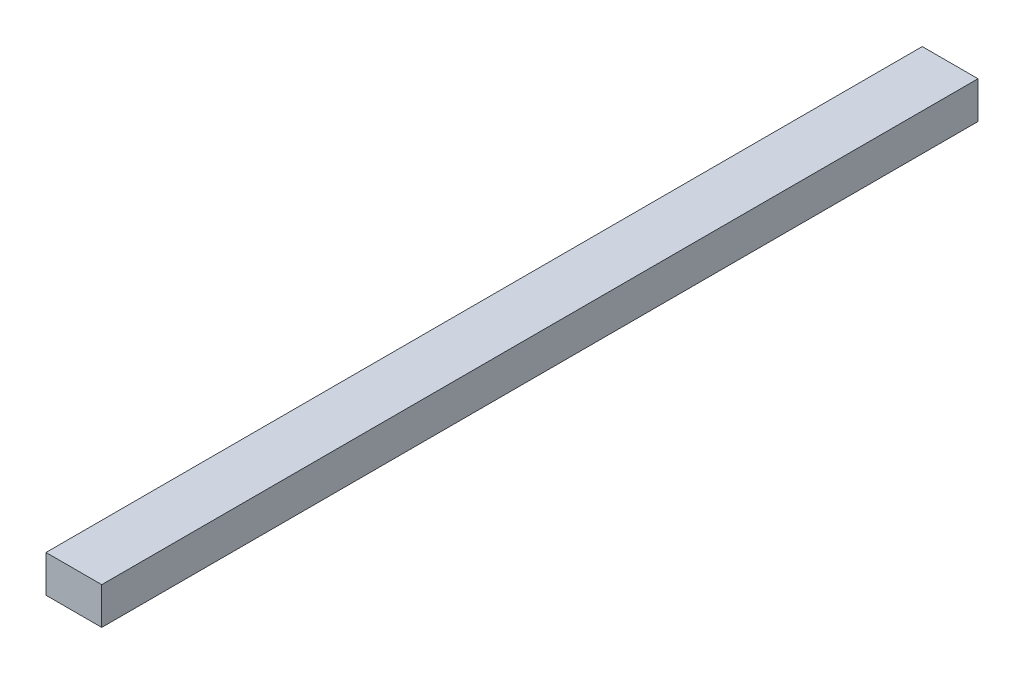
ISO-10303-21;
HEADER;
FILE_DESCRIPTION(('STEP AP214'),'2;1');
FILE_NAME('part.step','',(''),(''),'','','');
FILE_SCHEMA(('AUTOMOTIVE_DESIGN { 1 0 10303 214 1 1 1 1 }'));
ENDSEC;
DATA;
#1=APPLICATION_CONTEXT('core data for automotive mechanical design processes');
#2=APPLICATION_PROTOCOL_DEFINITION('international standard','automotive_design',2000,#1);
#3=PRODUCT_CONTEXT('',#1,'mechanical');
#4=PRODUCT('Part','Part','',(#3));
#5=PRODUCT_RELATED_PRODUCT_CATEGORY('part','',(#4));
#6=PRODUCT_DEFINITION_FORMATION('','',#4);
#7=PRODUCT_DEFINITION_CONTEXT('part definition',#1,'design');
#8=PRODUCT_DEFINITION('design','',#6,#7);
#9=PRODUCT_DEFINITION_SHAPE('','',#8);
#10=(LENGTH_UNIT() NAMED_UNIT(*) SI_UNIT(.MILLI.,.METRE.));
#11=(NAMED_UNIT(*) PLANE_ANGLE_UNIT() SI_UNIT($,.RADIAN.));
#12=(NAMED_UNIT(*) SI_UNIT($,.STERADIAN.) SOLID_ANGLE_UNIT());
#13=UNCERTAINTY_MEASURE_WITH_UNIT(LENGTH_MEASURE(1.E-05),#10,'distance_accuracy_value','');
#14=(GEOMETRIC_REPRESENTATION_CONTEXT(3) GLOBAL_UNCERTAINTY_ASSIGNED_CONTEXT((#13)) GLOBAL_UNIT_ASSIGNED_CONTEXT((#10,
#11,#12)) REPRESENTATION_CONTEXT('',''));
#15=CARTESIAN_POINT('',(0.,0.,0.));
#16=DIRECTION('',(0.,0.,1.));
#17=DIRECTION('',(1.,0.,0.));
#18=AXIS2_PLACEMENT_3D('',#15,#16,#17);
#19=CARTESIAN_POINT('',(0.,0.,-40.));
#20=DIRECTION('',(0.,0.,1.));
#21=DIRECTION('',(1.,0.,0.));
#22=AXIS2_PLACEMENT_3D('',#19,#20,#21);
#23=PLANE('',#22);
#24=DIRECTION('',(0.,1.,0.));
#25=VECTOR('',#24,1.);
#26=CARTESIAN_POINT('',(-17.,2.9,-40.));
#27=LINE('',#26,#25);
#28=CARTESIAN_POINT('',(-17.,0.,-40.));
#29=VERTEX_POINT('',#28);
#30=CARTESIAN_POINT('',(-17.,11.31,-40.));
#31=VERTEX_POINT('',#30);
#32=EDGE_CURVE('E103',#29,#31,#27,.T.);
#33=ORIENTED_EDGE('',*,*,#32,.F.);
#34=DIRECTION('',(1.,0.,0.));
#35=VECTOR('',#34,1.);
#36=CARTESIAN_POINT('',(-357.675,0.,-40.));
#37=LINE('',#36,#35);
#38=CARTESIAN_POINT('',(0.,0.,-40.));
#39=VERTEX_POINT('',#38);
#40=EDGE_CURVE('E49',#29,#39,#37,.T.);
#41=ORIENTED_EDGE('',*,*,#40,.T.);
#42=DIRECTION('',(0.,1.,0.));
#43=VECTOR('',#42,1.);
#44=CARTESIAN_POINT('',(0.,2.9,-40.));
#45=LINE('',#44,#43);
#46=CARTESIAN_POINT('',(0.,11.31,-40.));
#47=VERTEX_POINT('',#46);
#48=EDGE_CURVE('E101',#39,#47,#45,.T.);
#49=ORIENTED_EDGE('',*,*,#48,.T.);
#50=DIRECTION('',(1.,0.,0.));
#51=VECTOR('',#50,1.);
#52=CARTESIAN_POINT('',(-357.675,11.31,-40.));
#53=LINE('',#52,#51);
#54=EDGE_CURVE('E87',#31,#47,#53,.T.);
#55=ORIENTED_EDGE('',*,*,#54,.F.);
#56=EDGE_LOOP('',(#33,#41,#49,#55));
#57=FACE_BOUND('',#56,.T.);
#58=ADVANCED_FACE('F45',(#57),#23,.T.);
#59=CARTESIAN_POINT('',(0.,0.,-307.275));
#60=DIRECTION('',(0.,0.,-1.));
#61=DIRECTION('',(-1.,0.,0.));
#62=AXIS2_PLACEMENT_3D('',#59,#60,#61);
#63=PLANE('',#62);
#64=DIRECTION('',(0.,-1.,0.));
#65=VECTOR('',#64,1.);
#66=CARTESIAN_POINT('',(0.,2.9,-307.275));
#67=LINE('',#66,#65);
#68=CARTESIAN_POINT('',(0.,11.31,-307.275));
#69=VERTEX_POINT('',#68);
#70=CARTESIAN_POINT('',(0.,0.,-307.275));
#71=VERTEX_POINT('',#70);
#72=EDGE_CURVE('E102',#69,#71,#67,.T.);
#73=ORIENTED_EDGE('',*,*,#72,.T.);
#74=DIRECTION('',(-1.,0.,0.));
#75=VECTOR('',#74,1.);
#76=CARTESIAN_POINT('',(-357.675,0.,-307.275));
#77=LINE('',#76,#75);
#78=CARTESIAN_POINT('',(-17.,0.,-307.275));
#79=VERTEX_POINT('',#78);
#80=EDGE_CURVE('E11',#71,#79,#77,.T.);
#81=ORIENTED_EDGE('',*,*,#80,.T.);
#82=DIRECTION('',(0.,-1.,0.));
#83=VECTOR('',#82,1.);
#84=CARTESIAN_POINT('',(-17.,2.9,-307.275));
#85=LINE('',#84,#83);
#86=CARTESIAN_POINT('',(-17.,11.31,-307.275));
#87=VERTEX_POINT('',#86);
#88=EDGE_CURVE('E97',#87,#79,#85,.T.);
#89=ORIENTED_EDGE('',*,*,#88,.F.);
#90=DIRECTION('',(-1.,0.,0.));
#91=VECTOR('',#90,1.);
#92=CARTESIAN_POINT('',(-357.675,11.31,-307.275));
#93=LINE('',#92,#91);
#94=EDGE_CURVE('E98',#69,#87,#93,.T.);
#95=ORIENTED_EDGE('',*,*,#94,.F.);
#96=EDGE_LOOP('',(#73,#81,#89,#95));
#97=FACE_BOUND('',#96,.T.);
#98=ADVANCED_FACE('F47',(#97),#63,.T.);
#99=CARTESIAN_POINT('',(0.,2.9,0.));
#100=DIRECTION('',(-1.,0.,0.));
#101=DIRECTION('',(0.,0.,1.));
#102=AXIS2_PLACEMENT_3D('',#99,#100,#101);
#103=PLANE('',#102);
#104=ORIENTED_EDGE('',*,*,#48,.F.);
#105=DIRECTION('',(0.,0.,-1.));
#106=VECTOR('',#105,1.);
#107=CARTESIAN_POINT('',(0.,0.,0.));
#108=LINE('',#107,#106);
#109=EDGE_CURVE('E61',#39,#71,#108,.T.);
#110=ORIENTED_EDGE('',*,*,#109,.T.);
#111=ORIENTED_EDGE('',*,*,#72,.F.);
#112=DIRECTION('',(0.,0.,-1.));
#113=VECTOR('',#112,1.);
#114=CARTESIAN_POINT('',(0.,11.31,0.));
#115=LINE('',#114,#113);
#116=EDGE_CURVE('E91',#47,#69,#115,.T.);
#117=ORIENTED_EDGE('',*,*,#116,.F.);
#118=EDGE_LOOP('',(#104,#110,#111,#117));
#119=FACE_BOUND('',#118,.T.);
#120=ADVANCED_FACE('F104',(#119),#103,.F.);
#121=CARTESIAN_POINT('',(-17.,2.9,-17.));
#122=DIRECTION('',(-1.,0.,0.));
#123=DIRECTION('',(0.,0.,1.));
#124=AXIS2_PLACEMENT_3D('',#121,#122,#123);
#125=PLANE('',#124);
#126=DIRECTION('',(0.,0.,-1.));
#127=VECTOR('',#126,1.);
#128=CARTESIAN_POINT('',(-17.,0.,-17.));
#129=LINE('',#128,#127);
#130=EDGE_CURVE('E106',#29,#79,#129,.T.);
#131=ORIENTED_EDGE('',*,*,#130,.F.);
#132=ORIENTED_EDGE('',*,*,#32,.T.);
#133=DIRECTION('',(0.,0.,-1.));
#134=VECTOR('',#133,1.);
#135=CARTESIAN_POINT('',(-17.,11.31,-17.));
#136=LINE('',#135,#134);
#137=EDGE_CURVE('E93',#31,#87,#136,.T.);
#138=ORIENTED_EDGE('',*,*,#137,.T.);
#139=ORIENTED_EDGE('',*,*,#88,.T.);
#140=EDGE_LOOP('',(#131,#132,#138,#139));
#141=FACE_BOUND('',#140,.T.);
#142=ADVANCED_FACE('F116',(#141),#125,.T.);
#143=CARTESIAN_POINT('',(-357.675,11.31,-330.275));
#144=DIRECTION('',(0.,1.,0.));
#145=DIRECTION('',(0.,0.,1.));
#146=AXIS2_PLACEMENT_3D('',#143,#144,#145);
#147=PLANE('',#146);
#148=ORIENTED_EDGE('',*,*,#137,.F.);
#149=ORIENTED_EDGE('',*,*,#54,.T.);
#150=ORIENTED_EDGE('',*,*,#116,.T.);
#151=ORIENTED_EDGE('',*,*,#94,.T.);
#152=EDGE_LOOP('',(#148,#149,#150,#151));
#153=FACE_BOUND('',#152,.T.);
#154=ADVANCED_FACE('F89',(#153),#147,.T.);
#155=CARTESIAN_POINT('',(-357.675,0.,-330.275));
#156=DIRECTION('',(0.,1.,0.));
#157=DIRECTION('',(0.,0.,1.));
#158=AXIS2_PLACEMENT_3D('',#155,#156,#157);
#159=PLANE('',#158);
#160=ORIENTED_EDGE('',*,*,#40,.F.);
#161=ORIENTED_EDGE('',*,*,#130,.T.);
#162=ORIENTED_EDGE('',*,*,#80,.F.);
#163=ORIENTED_EDGE('',*,*,#109,.F.);
#164=EDGE_LOOP('',(#160,#161,#162,#163));
#165=FACE_BOUND('',#164,.T.);
#166=ADVANCED_FACE('F117',(#165),#159,.F.);
#167=CLOSED_SHELL('',(#58,#98,#120,#142,#154,#166));
#168=MANIFOLD_SOLID_BREP('B2',#167);
#169=ADVANCED_BREP_SHAPE_REPRESENTATION('',(#18,#168),#14);
#170=SHAPE_DEFINITION_REPRESENTATION(#9,#169);
ENDSEC;
END-ISO-10303-21;
